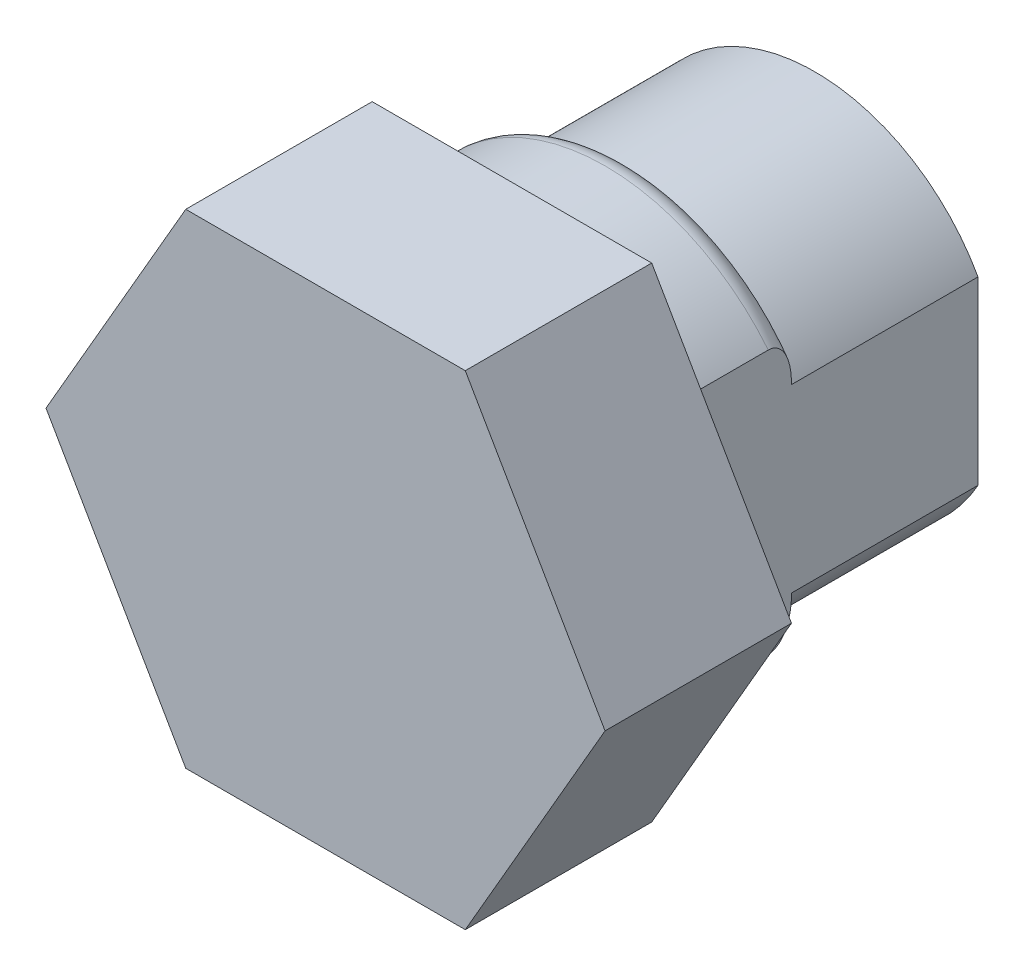
ISO-10303-21;
HEADER;
FILE_DESCRIPTION(('STEP AP214'),'2;1');
FILE_NAME('part.step','',(''),(''),'','','');
FILE_SCHEMA(('AUTOMOTIVE_DESIGN { 1 0 10303 214 1 1 1 1 }'));
ENDSEC;
DATA;
#1=APPLICATION_CONTEXT('core data for automotive mechanical design processes');
#2=APPLICATION_PROTOCOL_DEFINITION('international standard','automotive_design',2000,#1);
#3=PRODUCT_CONTEXT('',#1,'mechanical');
#4=PRODUCT('Part','Part','',(#3));
#5=PRODUCT_RELATED_PRODUCT_CATEGORY('part','',(#4));
#6=PRODUCT_DEFINITION_FORMATION('','',#4);
#7=PRODUCT_DEFINITION_CONTEXT('part definition',#1,'design');
#8=PRODUCT_DEFINITION('design','',#6,#7);
#9=PRODUCT_DEFINITION_SHAPE('','',#8);
#10=(LENGTH_UNIT() NAMED_UNIT(*) SI_UNIT(.MILLI.,.METRE.));
#11=(NAMED_UNIT(*) PLANE_ANGLE_UNIT() SI_UNIT($,.RADIAN.));
#12=(NAMED_UNIT(*) SI_UNIT($,.STERADIAN.) SOLID_ANGLE_UNIT());
#13=UNCERTAINTY_MEASURE_WITH_UNIT(LENGTH_MEASURE(1.E-05),#10,'distance_accuracy_value','');
#14=(GEOMETRIC_REPRESENTATION_CONTEXT(3) GLOBAL_UNCERTAINTY_ASSIGNED_CONTEXT((#13)) GLOBAL_UNIT_ASSIGNED_CONTEXT((#10,
#11,#12)) REPRESENTATION_CONTEXT('',''));
#15=CARTESIAN_POINT('',(0.,0.,0.));
#16=DIRECTION('',(0.,0.,1.));
#17=DIRECTION('',(1.,0.,0.));
#18=AXIS2_PLACEMENT_3D('',#15,#16,#17);
#19=CARTESIAN_POINT('',(0.,0.,8.));
#20=DIRECTION('',(0.,0.,-1.));
#21=DIRECTION('',(-1.,0.,0.));
#22=AXIS2_PLACEMENT_3D('',#19,#20,#21);
#23=CYLINDRICAL_SURFACE('',#22,8.);
#24=DIRECTION('',(0.,0.,-1.));
#25=VECTOR('',#24,1.);
#26=CARTESIAN_POINT('',(0.499999999999999,-7.98435971133565,8.));
#27=LINE('',#26,#25);
#28=CARTESIAN_POINT('',(0.499999999999999,-7.98435971133565,0.));
#29=VERTEX_POINT('',#28);
#30=CARTESIAN_POINT('',(0.499999999999999,-7.98435971133566,7.99999999999996));
#31=VERTEX_POINT('',#30);
#32=EDGE_CURVE('E209',#29,#31,#27,.F.);
#33=ORIENTED_EDGE('',*,*,#32,.F.);
#34=CARTESIAN_POINT('',(0.,0.,0.));
#35=DIRECTION('',(0.,0.,1.));
#36=DIRECTION('',(1.,0.,0.));
#37=AXIS2_PLACEMENT_3D('',#34,#35,#36);
#38=CIRCLE('',#37,8.);
#39=CARTESIAN_POINT('',(7.,-3.87298334620742,0.));
#40=VERTEX_POINT('',#39);
#41=EDGE_CURVE('E181',#29,#40,#38,.T.);
#42=ORIENTED_EDGE('',*,*,#41,.T.);
#43=DIRECTION('',(0.,0.,-1.));
#44=VECTOR('',#43,1.);
#45=CARTESIAN_POINT('',(7.,-3.87298334620742,8.));
#46=LINE('',#45,#44);
#47=CARTESIAN_POINT('',(7.,-3.87298334620742,8.));
#48=VERTEX_POINT('',#47);
#49=EDGE_CURVE('E233',#40,#48,#46,.F.);
#50=ORIENTED_EDGE('',*,*,#49,.T.);
#51=CARTESIAN_POINT('',(0.,0.,8.));
#52=DIRECTION('',(0.,0.,1.));
#53=DIRECTION('',(1.,0.,0.));
#54=AXIS2_PLACEMENT_3D('',#51,#52,#53);
#55=CIRCLE('',#54,8.);
#56=EDGE_CURVE('E295',#31,#48,#55,.T.);
#57=ORIENTED_EDGE('',*,*,#56,.F.);
#58=EDGE_LOOP('',(#33,#42,#50,#57));
#59=FACE_BOUND('',#58,.T.);
#60=ADVANCED_FACE('F33',(#59),#23,.T.);
#61=DIRECTION('',(0.,0.,-1.));
#62=VECTOR('',#61,1.);
#63=CARTESIAN_POINT('',(-0.500000000000001,-7.98435971133565,8.));
#64=LINE('',#63,#62);
#65=CARTESIAN_POINT('',(-0.500000000000001,-7.98435971133565,8.));
#66=VERTEX_POINT('',#65);
#67=CARTESIAN_POINT('',(-0.500000000000001,-7.98435971133565,0.));
#68=VERTEX_POINT('',#67);
#69=EDGE_CURVE('E201',#66,#68,#64,.T.);
#70=ORIENTED_EDGE('',*,*,#69,.F.);
#71=CARTESIAN_POINT('',(-7.,-3.87298334620742,8.));
#72=VERTEX_POINT('',#71);
#73=EDGE_CURVE('E294',#72,#66,#55,.T.);
#74=ORIENTED_EDGE('',*,*,#73,.F.);
#75=DIRECTION('',(0.,0.,-1.));
#76=VECTOR('',#75,1.);
#77=CARTESIAN_POINT('',(-7.,-3.87298334620742,8.));
#78=LINE('',#77,#76);
#79=CARTESIAN_POINT('',(-7.,-3.87298334620742,0.));
#80=VERTEX_POINT('',#79);
#81=EDGE_CURVE('E223',#80,#72,#78,.F.);
#82=ORIENTED_EDGE('',*,*,#81,.F.);
#83=EDGE_CURVE('E299',#80,#68,#38,.T.);
#84=ORIENTED_EDGE('',*,*,#83,.T.);
#85=EDGE_LOOP('',(#70,#74,#82,#84));
#86=FACE_BOUND('',#85,.T.);
#87=ADVANCED_FACE('F361',(#86),#23,.T.);
#88=CARTESIAN_POINT('',(0.,0.,13.));
#89=DIRECTION('',(0.,0.,-1.));
#90=DIRECTION('',(-1.,0.,0.));
#91=AXIS2_PLACEMENT_3D('',#88,#89,#90);
#92=CYLINDRICAL_SURFACE('',#91,9.);
#93=DIRECTION('',(0.,0.,-1.));
#94=VECTOR('',#93,1.);
#95=CARTESIAN_POINT('',(0.499999999999999,-8.98610037780571,13.));
#96=LINE('',#95,#94);
#97=CARTESIAN_POINT('',(0.499999999999999,-8.98610037780572,9.));
#98=VERTEX_POINT('',#97);
#99=CARTESIAN_POINT('',(0.499999999999999,-8.98610037780571,13.));
#100=VERTEX_POINT('',#99);
#101=EDGE_CURVE('E207',#98,#100,#96,.F.);
#102=ORIENTED_EDGE('',*,*,#101,.F.);
#103=CARTESIAN_POINT('',(0.,0.,9.));
#104=DIRECTION('',(0.,0.,1.));
#105=DIRECTION('',(1.,0.,0.));
#106=AXIS2_PLACEMENT_3D('',#103,#104,#105);
#107=CIRCLE('',#106,9.);
#108=CARTESIAN_POINT('',(7.,-5.65685424949238,9.));
#109=VERTEX_POINT('',#108);
#110=EDGE_CURVE('E293',#98,#109,#107,.T.);
#111=ORIENTED_EDGE('',*,*,#110,.T.);
#112=DIRECTION('',(0.,0.,-1.));
#113=VECTOR('',#112,1.);
#114=CARTESIAN_POINT('',(7.,-5.65685424949238,13.));
#115=LINE('',#114,#113);
#116=CARTESIAN_POINT('',(7.,-5.65685424949238,13.));
#117=VERTEX_POINT('',#116);
#118=EDGE_CURVE('E230',#109,#117,#115,.F.);
#119=ORIENTED_EDGE('',*,*,#118,.T.);
#120=CARTESIAN_POINT('',(0.,0.,13.));
#121=DIRECTION('',(0.,0.,1.));
#122=DIRECTION('',(1.,0.,0.));
#123=AXIS2_PLACEMENT_3D('',#120,#121,#122);
#124=CIRCLE('',#123,9.);
#125=EDGE_CURVE('E286',#100,#117,#124,.T.);
#126=ORIENTED_EDGE('',*,*,#125,.F.);
#127=EDGE_LOOP('',(#102,#111,#119,#126));
#128=FACE_BOUND('',#127,.T.);
#129=ADVANCED_FACE('F366',(#128),#92,.T.);
#130=DIRECTION('',(0.,0.,-1.));
#131=VECTOR('',#130,1.);
#132=CARTESIAN_POINT('',(-0.500000000000001,-8.98610037780571,13.));
#133=LINE('',#132,#131);
#134=CARTESIAN_POINT('',(-0.500000000000001,-8.98610037780571,13.));
#135=VERTEX_POINT('',#134);
#136=CARTESIAN_POINT('',(-0.500000000000001,-8.98610037780571,9.));
#137=VERTEX_POINT('',#136);
#138=EDGE_CURVE('E52',#135,#137,#133,.T.);
#139=ORIENTED_EDGE('',*,*,#138,.F.);
#140=CARTESIAN_POINT('',(-7.,-5.65685424949238,13.));
#141=VERTEX_POINT('',#140);
#142=EDGE_CURVE('E290',#141,#135,#124,.T.);
#143=ORIENTED_EDGE('',*,*,#142,.F.);
#144=DIRECTION('',(0.,0.,-1.));
#145=VECTOR('',#144,1.);
#146=CARTESIAN_POINT('',(-7.,-5.65685424949238,13.));
#147=LINE('',#146,#145);
#148=CARTESIAN_POINT('',(-7.,-5.65685424949238,9.));
#149=VERTEX_POINT('',#148);
#150=EDGE_CURVE('E215',#149,#141,#147,.F.);
#151=ORIENTED_EDGE('',*,*,#150,.F.);
#152=EDGE_CURVE('E300',#149,#137,#107,.T.);
#153=ORIENTED_EDGE('',*,*,#152,.T.);
#154=EDGE_LOOP('',(#139,#143,#151,#153));
#155=FACE_BOUND('',#154,.T.);
#156=ADVANCED_FACE('F401',(#155),#92,.T.);
#157=CARTESIAN_POINT('',(0.,0.,13.));
#158=DIRECTION('',(0.,0.,1.));
#159=DIRECTION('',(1.,0.,0.));
#160=AXIS2_PLACEMENT_3D('',#157,#158,#159);
#161=PLANE('',#160);
#162=DIRECTION('',(0.,-1.,0.));
#163=VECTOR('',#162,1.);
#164=CARTESIAN_POINT('',(0.499999999999999,-7.0725148219795,13.));
#165=LINE('',#164,#163);
#166=CARTESIAN_POINT('',(0.499999999999999,-10.3882095556926,13.));
#167=VERTEX_POINT('',#166);
#168=EDGE_CURVE('E199',#100,#167,#165,.T.);
#169=ORIENTED_EDGE('',*,*,#168,.F.);
#170=ORIENTED_EDGE('',*,*,#125,.T.);
#171=DIRECTION('',(0.,1.,0.));
#172=VECTOR('',#171,1.);
#173=CARTESIAN_POINT('',(7.,0.,13.));
#174=LINE('',#173,#172);
#175=CARTESIAN_POINT('',(7.,5.65685424949238,13.));
#176=VERTEX_POINT('',#175);
#177=EDGE_CURVE('E212',#117,#176,#174,.T.);
#178=ORIENTED_EDGE('',*,*,#177,.T.);
#179=CARTESIAN_POINT('',(-7.,5.65685424949238,13.));
#180=VERTEX_POINT('',#179);
#181=EDGE_CURVE('E287',#176,#180,#124,.T.);
#182=ORIENTED_EDGE('',*,*,#181,.T.);
#183=DIRECTION('',(0.,1.,0.));
#184=VECTOR('',#183,1.);
#185=CARTESIAN_POINT('',(-7.,0.,13.));
#186=LINE('',#185,#184);
#187=EDGE_CURVE('E218',#141,#180,#186,.T.);
#188=ORIENTED_EDGE('',*,*,#187,.F.);
#189=ORIENTED_EDGE('',*,*,#142,.T.);
#190=DIRECTION('',(0.,1.,0.));
#191=VECTOR('',#190,1.);
#192=CARTESIAN_POINT('',(-0.500000000000001,-7.0725148219795,13.));
#193=LINE('',#192,#191);
#194=CARTESIAN_POINT('',(-0.500000000000001,-10.3882095556926,13.));
#195=VERTEX_POINT('',#194);
#196=EDGE_CURVE('E185',#195,#135,#193,.T.);
#197=ORIENTED_EDGE('',*,*,#196,.F.);
#198=DIRECTION('',(1.,0.,0.));
#199=VECTOR('',#198,1.);
#200=CARTESIAN_POINT('',(-5.99763558337725,-10.3882095556926,13.));
#201=LINE('',#200,#199);
#202=CARTESIAN_POINT('',(-5.99763558337725,-10.3882095556926,13.));
#203=VERTEX_POINT('',#202);
#204=EDGE_CURVE('E247',#203,#195,#201,.T.);
#205=ORIENTED_EDGE('',*,*,#204,.F.);
#206=DIRECTION('',(0.500000000000007,-0.866025403784435,0.));
#207=VECTOR('',#206,1.);
#208=CARTESIAN_POINT('',(-11.9952711667547,0.,13.));
#209=LINE('',#208,#207);
#210=CARTESIAN_POINT('',(-11.9952711667547,0.,13.));
#211=VERTEX_POINT('',#210);
#212=EDGE_CURVE('E265',#211,#203,#209,.T.);
#213=ORIENTED_EDGE('',*,*,#212,.F.);
#214=DIRECTION('',(-0.499999999999995,-0.866025403784441,0.));
#215=VECTOR('',#214,1.);
#216=CARTESIAN_POINT('',(-5.9976355833774,10.3882095556925,13.));
#217=LINE('',#216,#215);
#218=CARTESIAN_POINT('',(-5.9976355833774,10.3882095556925,13.));
#219=VERTEX_POINT('',#218);
#220=EDGE_CURVE('E263',#219,#211,#217,.T.);
#221=ORIENTED_EDGE('',*,*,#220,.F.);
#222=DIRECTION('',(-1.,0.,0.));
#223=VECTOR('',#222,1.);
#224=CARTESIAN_POINT('',(5.99763558337732,10.3882095556926,13.));
#225=LINE('',#224,#223);
#226=CARTESIAN_POINT('',(5.99763558337732,10.3882095556926,13.));
#227=VERTEX_POINT('',#226);
#228=EDGE_CURVE('E261',#227,#219,#225,.T.);
#229=ORIENTED_EDGE('',*,*,#228,.F.);
#230=DIRECTION('',(-0.500000000000001,0.866025403784438,0.));
#231=VECTOR('',#230,1.);
#232=CARTESIAN_POINT('',(11.9952711667547,0.,13.));
#233=LINE('',#232,#231);
#234=CARTESIAN_POINT('',(11.9952711667547,0.,13.));
#235=VERTEX_POINT('',#234);
#236=EDGE_CURVE('E259',#235,#227,#233,.T.);
#237=ORIENTED_EDGE('',*,*,#236,.F.);
#238=DIRECTION('',(0.499999999999995,0.866025403784441,0.));
#239=VECTOR('',#238,1.);
#240=CARTESIAN_POINT('',(5.99763558337747,-10.3882095556925,13.));
#241=LINE('',#240,#239);
#242=CARTESIAN_POINT('',(5.99763558337747,-10.3882095556925,13.));
#243=VERTEX_POINT('',#242);
#244=EDGE_CURVE('E242',#243,#235,#241,.T.);
#245=ORIENTED_EDGE('',*,*,#244,.F.);
#246=EDGE_CURVE('E267',#167,#243,#201,.T.);
#247=ORIENTED_EDGE('',*,*,#246,.F.);
#248=EDGE_LOOP('',(#169,#170,#178,#182,#188,#189,#197,#205,#213,#221,#229,#237,#245,#247));
#249=FACE_BOUND('',#248,.T.);
#250=ADVANCED_FACE('F345',(#249),#161,.F.);
#251=CARTESIAN_POINT('',(0.,0.,9.));
#252=DIRECTION('',(0.,0.,1.));
#253=DIRECTION('',(1.,0.,0.));
#254=AXIS2_PLACEMENT_3D('',#251,#252,#253);
#255=TOROIDAL_SURFACE('',#254,8.,1.);
#256=ORIENTED_EDGE('',*,*,#110,.F.);
#257=CARTESIAN_POINT('',(0.499999999999999,-8.66024322517779,8.26187592581212));
#258=CARTESIAN_POINT('',(0.499999999999999,-8.61865872685159,8.22393319159111));
#259=CARTESIAN_POINT('',(0.499999999999999,-8.57383523766527,8.18947879089425));
#260=CARTESIAN_POINT('',(0.499999999999999,-8.47899989037954,8.12856004026763));
#261=CARTESIAN_POINT('',(0.499999999999999,-8.42898174540785,8.10210552728329));
#262=CARTESIAN_POINT('',(0.499999999999999,-8.32523777849372,8.05797947270386));
#263=CARTESIAN_POINT('',(0.499999999999999,-8.27151399444691,8.0403031467672));
#264=CARTESIAN_POINT('',(0.499999999999999,-8.16187811369211,8.01421517091775));
#265=CARTESIAN_POINT('',(0.499999999999999,-8.10596656433086,8.00580121884887));
#266=CARTESIAN_POINT('',(0.499999999999999,-7.99345639597833,7.99845762014326));
#267=CARTESIAN_POINT('',(0.499999999999999,-7.93685703437675,7.99953934340476));
#268=CARTESIAN_POINT('',(0.499999999999999,-7.82463943329287,8.01118224893528));
#269=CARTESIAN_POINT('',(0.499999999999999,-7.76902123893041,8.02174386599273));
#270=CARTESIAN_POINT('',(0.499999999999999,-7.66030639047841,8.05205973653048));
#271=CARTESIAN_POINT('',(0.499999999999999,-7.60721155206088,8.07182050207525));
#272=CARTESIAN_POINT('',(0.499999999999999,-7.50509556457223,8.11998021406199));
#273=CARTESIAN_POINT('',(0.499999999999999,-7.45607440460512,8.14837913739827));
#274=CARTESIAN_POINT('',(0.499999999999999,-7.36353035315005,8.21299589202989));
#275=CARTESIAN_POINT('',(0.499999999999999,-7.32000433399105,8.24920924349308));
#276=CARTESIAN_POINT('',(0.499999999999999,-7.23966377301843,8.32844156134991));
#277=CARTESIAN_POINT('',(0.499999999999999,-7.20284915842519,8.37146045393362));
#278=CARTESIAN_POINT('',(0.499999999999999,-7.13705149858263,8.4629989820487));
#279=CARTESIAN_POINT('',(0.499999999999999,-7.10805406123128,8.51150827213052));
#280=CARTESIAN_POINT('',(0.499999999999999,-7.05863687845514,8.61271530628358));
#281=CARTESIAN_POINT('',(0.499999999999999,-7.03821702442697,8.66541299731417));
#282=CARTESIAN_POINT('',(0.499999999999999,-7.00658336211747,8.77336872942733));
#283=CARTESIAN_POINT('',(0.499999999999999,-6.99534816139451,8.82862050241373));
#284=CARTESIAN_POINT('',(0.499999999999999,-6.98232902381977,8.94022636266091));
#285=CARTESIAN_POINT('',(0.499999999999999,-6.98054498266883,8.99658043775025));
#286=CARTESIAN_POINT('',(0.499999999999999,-6.98647507573754,9.10870003767633));
#287=CARTESIAN_POINT('',(0.499999999999999,-6.9941747432575,9.16446632838489));
#288=CARTESIAN_POINT('',(0.499999999999999,-7.01882532176232,9.27391498171632));
#289=CARTESIAN_POINT('',(0.499999999999999,-7.03577622464295,9.32759734616469));
#290=CARTESIAN_POINT('',(0.499999999999999,-7.07844600428096,9.43137002783357));
#291=CARTESIAN_POINT('',(0.499999999999999,-7.10416686498209,9.48145952916897));
#292=CARTESIAN_POINT('',(0.499999999999999,-7.16363811990137,9.57662008997361));
#293=CARTESIAN_POINT('',(0.499999999999999,-7.19738858363534,9.62169110599066));
#294=CARTESIAN_POINT('',(0.499999999999999,-7.27202492582089,9.70562519720033));
#295=CARTESIAN_POINT('',(0.499999999999999,-7.31292374112938,9.74447676812568));
#296=CARTESIAN_POINT('',(0.499999999999999,-7.40065030640319,9.81478159383546));
#297=CARTESIAN_POINT('',(0.499999999999999,-7.44747813227375,9.84623475388812));
#298=CARTESIAN_POINT('',(0.499999999999999,-7.54585085473459,9.90092597532351));
#299=CARTESIAN_POINT('',(0.499999999999999,-7.5974064726582,9.92414475305317));
#300=CARTESIAN_POINT('',(0.499999999999999,-7.70367998621133,9.96161319317048));
#301=CARTESIAN_POINT('',(0.499999999999999,-7.75839791295633,9.97586276728943));
#302=CARTESIAN_POINT('',(0.499999999999999,-7.86953690650958,9.9950074374053));
#303=CARTESIAN_POINT('',(0.499999999999999,-7.92596055581478,9.99988754482455));
#304=CARTESIAN_POINT('',(0.499999999999999,-8.03882675897211,10.0001086049065));
#305=CARTESIAN_POINT('',(0.499999999999999,-8.09526931289092,9.99544952356386));
#306=CARTESIAN_POINT('',(0.499999999999999,-8.2065853225696,9.97671822206807));
#307=CARTESIAN_POINT('',(0.499999999999999,-8.26145837705858,9.96264361670577));
#308=CARTESIAN_POINT('',(0.499999999999999,-8.36805897210437,9.92547297232276));
#309=CARTESIAN_POINT('',(0.499999999999999,-8.41978652777177,9.90237697664363));
#310=CARTESIAN_POINT('',(0.499999999999999,-8.51857302340189,9.84784049813906));
#311=CARTESIAN_POINT('',(0.499999999999999,-8.56563641647957,9.8164080820367));
#312=CARTESIAN_POINT('',(0.499999999999999,-8.65380726769656,9.74607620659079));
#313=CARTESIAN_POINT('',(0.499999999999999,-8.69491476273547,9.70717679351228));
#314=CARTESIAN_POINT('',(0.499999999999999,-8.76993618006173,9.62308177148391));
#315=CARTESIAN_POINT('',(0.499999999999999,-8.80386153788138,9.57789636426252));
#316=CARTESIAN_POINT('',(0.499999999999999,-8.86363063291848,9.48246383460788));
#317=CARTESIAN_POINT('',(0.499999999999999,-8.88947442498477,9.43221674653084));
#318=CARTESIAN_POINT('',(0.499999999999999,-8.9323054364355,9.32817163768832));
#319=CARTESIAN_POINT('',(0.499999999999999,-8.94930638253951,9.27437926740454));
#320=CARTESIAN_POINT('',(0.499999999999999,-8.97402484918681,9.16470448112489));
#321=CARTESIAN_POINT('',(0.499999999999999,-8.98174279687792,9.10882216141795));
#322=CARTESIAN_POINT('',(0.499999999999999,-8.98767225009435,8.99661924512309));
#323=CARTESIAN_POINT('',(0.499999999999999,-8.98589447521636,8.94029921438105));
#324=CARTESIAN_POINT('',(0.499999999999999,-8.97290534943117,8.82874224785496));
#325=CARTESIAN_POINT('',(0.499999999999999,-8.96169167084195,8.77350558276019));
#326=CARTESIAN_POINT('',(0.499999999999999,-8.93014879774606,8.66568719977959));
#327=CARTESIAN_POINT('',(0.499999999999999,-8.90981685761981,8.61310628688298));
#328=CARTESIAN_POINT('',(0.499999999999999,-8.86062978552562,8.51214899655757));
#329=CARTESIAN_POINT('',(0.499999999999999,-8.83178493997232,8.46376763546017));
#330=CARTESIAN_POINT('',(0.499999999999999,-8.77878055814951,8.38978704765608));
#331=CARTESIAN_POINT('',(0.499999999999999,-8.75696075103206,8.36248049308622));
#332=CARTESIAN_POINT('',(0.499999999999999,-8.71059052690818,8.31029379330074));
#333=CARTESIAN_POINT('',(0.499999999999999,-8.68604011032438,8.28541364770957));
#334=CARTESIAN_POINT('',(0.499999999999999,-8.66024322517779,8.26187592581212));
#335=B_SPLINE_CURVE_WITH_KNOTS('',3,(#257,#258,#259,#260,#261,#262,#263,#264,#265,#266,#267,
#268,#269,#270,#271,#272,#273,#274,#275,#276,#277,#278,#279,#280,#281,#282,#283,#284,#285,#286,
#287,#288,#289,#290,#291,#292,#293,#294,#295,#296,#297,#298,#299,#300,#301,#302,#303,#304,#305,
#306,#307,#308,#309,#310,#311,#312,#313,#314,#315,#316,#317,#318,#319,#320,#321,#322,#323,#324,
#325,#326,#327,#328,#329,#330,#331,#332,#333,#334),.UNSPECIFIED.,.T.,.F.,(4,2,2,2,2,2,2,2,2,2,2,
2,2,2,2,2,2,2,2,2,2,2,2,2,2,2,2,2,2,2,2,2,2,2,2,2,2,2,4),(0.,0.168751797764604,
0.337710262771788,0.50657653965275,0.675400835463925,0.844427305062611,1.01346152733367,
1.18261559108104,1.35176920237231,1.52082609819105,1.68988116061837,1.85862281877606,
2.02736234038024,2.19570771335849,2.36405122854179,2.53213826581186,2.70022515583556,
2.86835009580595,3.036476491361,3.20491036819871,3.37334640160343,3.54217432123319,
3.71100390232482,3.88010334014921,4.04920338077987,4.21834627529451,4.38748835720379,
4.55646736246646,4.72544532077973,4.89415217136056,5.06285787691871,5.23130091369702,
5.39973619944207,5.56798138101679,5.7362680780779,5.90460548237135,6.07274030626203,
6.17742526325843,6.28211020405217),.UNSPECIFIED.);
#336=EDGE_CURVE('E11',#98,#31,#335,.T.);
#337=ORIENTED_EDGE('',*,*,#336,.T.);
#338=ORIENTED_EDGE('',*,*,#56,.T.);
#339=CARTESIAN_POINT('',(7.,-5.65685424949238,9.));
#340=CARTESIAN_POINT('',(7.,-5.65685911724098,8.97923940691457));
#341=CARTESIAN_POINT('',(7.,-5.65582471290436,8.95849280172404));
#342=CARTESIAN_POINT('',(7.,-5.65173267756998,8.91721974231378));
#343=CARTESIAN_POINT('',(7.,-5.64867700208882,8.89669309477786));
#344=CARTESIAN_POINT('',(7.,-5.63664614991689,8.83611526480784));
#345=CARTESIAN_POINT('',(7.,-5.62480441345385,8.79660524627055));
#346=CARTESIAN_POINT('',(7.,-5.59450303461577,8.72045034974561));
#347=CARTESIAN_POINT('',(7.,-5.57606672846917,8.68379591675615));
#348=CARTESIAN_POINT('',(7.,-5.53376244371056,8.61368775216316));
#349=CARTESIAN_POINT('',(7.,-5.50987991802476,8.58024293983661));
#350=CARTESIAN_POINT('',(7.,-5.44571696479316,8.50203184095132));
#351=CARTESIAN_POINT('',(7.,-5.40298945443793,8.45927985225059));
#352=CARTESIAN_POINT('',(7.,-5.31139784192795,8.38104847513847));
#353=CARTESIAN_POINT('',(7.,-5.26252382944355,8.34558108086482));
#354=CARTESIAN_POINT('',(7.,-5.13128822638562,8.26258919623405));
#355=CARTESIAN_POINT('',(7.,-5.04587839303067,8.2199190526631));
#356=CARTESIAN_POINT('',(7.,-4.86942025547898,8.14769392398842));
#357=CARTESIAN_POINT('',(7.,-4.77834350968735,8.11821240250006));
#358=CARTESIAN_POINT('',(7.,-4.6190935381239,8.07679160414368));
#359=CARTESIAN_POINT('',(7.,-4.55156838137016,8.0622550332273));
#360=CARTESIAN_POINT('',(7.,-4.41559399169471,8.03810124904663));
#361=CARTESIAN_POINT('',(7.,-4.34714402318652,8.02848822107254));
#362=CARTESIAN_POINT('',(7.,-4.21108801374642,8.01370252744642));
#363=CARTESIAN_POINT('',(7.,-4.14349033685777,8.008449693619));
#364=CARTESIAN_POINT('',(7.,-4.00824723487945,8.00160903069849));
#365=CARTESIAN_POINT('',(7.,-3.94060220575656,8.00001355477364));
#366=CARTESIAN_POINT('',(7.,-3.87298334620742,8.));
#367=B_SPLINE_CURVE_WITH_KNOTS('',3,(#339,#340,#341,#342,#343,#344,#345,#346,#347,#348,#349,
#350,#351,#352,#353,#354,#355,#356,#357,#358,#359,#360,#361,#362,#363,#364,#365,#366),
.UNSPECIFIED.,.F.,.F.,(4,2,2,2,2,2,2,2,2,2,2,2,2,4),(0.,0.0622297970683524,0.124399476637808,
0.24737938802525,0.36992834673037,0.492808554412042,0.673119945086272,0.85372588096302,
1.13856125057575,1.42496404234678,1.63199049314366,1.83919263727246,2.04249496179969,
2.24537183105546),.UNSPECIFIED.);
#368=EDGE_CURVE('E309',#109,#48,#367,.T.);
#369=ORIENTED_EDGE('',*,*,#368,.F.);
#370=EDGE_LOOP('',(#256,#337,#338,#369));
#371=FACE_BOUND('',#370,.T.);
#372=ADVANCED_FACE('F340',(#371),#255,.T.);
#373=ORIENTED_EDGE('',*,*,#73,.T.);
#374=CARTESIAN_POINT('',(-0.500000000000001,-8.66024322517779,8.26187592581212));
#375=CARTESIAN_POINT('',(-0.500000000000001,-8.70172458500228,8.29973130309595));
#376=CARTESIAN_POINT('',(-0.500000000000001,-8.74004263176906,8.34111306795245));
#377=CARTESIAN_POINT('',(-0.500000000000001,-8.8092205904506,8.42975562136744));
#378=CARTESIAN_POINT('',(-0.500000000000001,-8.84007161506814,8.4770233150904));
#379=CARTESIAN_POINT('',(-0.500000000000001,-8.89338483119361,8.57605430223978));
#380=CARTESIAN_POINT('',(-0.500000000000001,-8.91585053727007,8.62781570096553));
#381=CARTESIAN_POINT('',(-0.500000000000001,-8.95175763481953,8.73436396295248));
#382=CARTESIAN_POINT('',(-0.500000000000001,-8.96520125373997,8.78915007582956));
#383=CARTESIAN_POINT('',(-0.500000000000001,-8.9826824239134,8.90015973004582));
#384=CARTESIAN_POINT('',(-0.500000000000001,-8.98672724538706,8.95638212632227));
#385=CARTESIAN_POINT('',(-0.500000000000001,-8.985315863236,9.06870949172706));
#386=CARTESIAN_POINT('',(-0.500000000000001,-8.97985932950437,9.12481445670767));
#387=CARTESIAN_POINT('',(-0.500000000000001,-8.95960583475184,9.23528478625316));
#388=CARTESIAN_POINT('',(-0.500000000000001,-8.94481327471212,9.28965095780095));
#389=CARTESIAN_POINT('',(-0.500000000000001,-8.9063148309599,9.39512970862254));
#390=CARTESIAN_POINT('',(-0.500000000000001,-8.88260895761987,9.44624229168248));
#391=CARTESIAN_POINT('',(-0.500000000000001,-8.82694799041101,9.54378952528678));
#392=CARTESIAN_POINT('',(-0.500000000000001,-8.79498915172027,9.59022203889517));
#393=CARTESIAN_POINT('',(-0.500000000000001,-8.72373869266841,9.6770708655077));
#394=CARTESIAN_POINT('',(-0.500000000000001,-8.68444704563024,9.71748715662361));
#395=CARTESIAN_POINT('',(-0.500000000000001,-8.59959567878776,9.79121104053518));
#396=CARTESIAN_POINT('',(-0.500000000000001,-8.55402828517498,9.82450980100996));
#397=CARTESIAN_POINT('',(-0.500000000000001,-8.45795733227471,9.8829993317088));
#398=CARTESIAN_POINT('',(-0.500000000000001,-8.40745372544305,9.90819002382823));
#399=CARTESIAN_POINT('',(-0.500000000000001,-8.30285512712632,9.94979232300733));
#400=CARTESIAN_POINT('',(-0.500000000000001,-8.24875435971687,9.96618940798802));
#401=CARTESIAN_POINT('',(-0.500000000000001,-8.13856978152801,9.98968307318699));
#402=CARTESIAN_POINT('',(-0.500000000000001,-8.0824859535223,9.99677957259317));
#403=CARTESIAN_POINT('',(-0.500000000000001,-7.9698384665944,10.0014790126445));
#404=CARTESIAN_POINT('',(-0.500000000000001,-7.91327421961739,9.99906786449707));
#405=CARTESIAN_POINT('',(-0.500000000000001,-7.80135171976705,9.98479018601099));
#406=CARTESIAN_POINT('',(-0.500000000000001,-7.74599347403404,9.97292359970553));
#407=CARTESIAN_POINT('',(-0.500000000000001,-7.63801765528594,9.94005895307464));
#408=CARTESIAN_POINT('',(-0.500000000000001,-7.58540188570325,9.91905496682199));
#409=CARTESIAN_POINT('',(-0.500000000000001,-7.48444647884783,9.86850605688891));
#410=CARTESIAN_POINT('',(-0.500000000000001,-7.4361068359877,9.83896114436866));
#411=CARTESIAN_POINT('',(-0.500000000000001,-7.34511383786895,9.77218620041296));
#412=CARTESIAN_POINT('',(-0.500000000000001,-7.30245668308578,9.73496134695123));
#413=CARTESIAN_POINT('',(-0.500000000000001,-7.22401209668411,9.65386606964869));
#414=CARTESIAN_POINT('',(-0.500000000000001,-7.18822460004132,9.60999570871749));
#415=CARTESIAN_POINT('',(-0.500000000000001,-7.12461074279031,9.51694363017024));
#416=CARTESIAN_POINT('',(-0.500000000000001,-7.09676920863573,9.46777228615595));
#417=CARTESIAN_POINT('',(-0.500000000000001,-7.04975871070044,9.36544523881627));
#418=CARTESIAN_POINT('',(-0.500000000000001,-7.03058962612148,9.31228959100012));
#419=CARTESIAN_POINT('',(-0.500000000000001,-7.00151305551076,9.203635397102));
#420=CARTESIAN_POINT('',(-0.500000000000001,-6.99158416343933,9.14814257894675));
#421=CARTESIAN_POINT('',(-0.500000000000001,-6.98119854946647,9.03627771020089));
#422=CARTESIAN_POINT('',(-0.500000000000001,-6.98074173564009,8.97990566814831));
#423=CARTESIAN_POINT('',(-0.500000000000001,-6.98930717355724,8.86796750400034));
#424=CARTESIAN_POINT('',(-0.500000000000001,-6.99831594806109,8.81240034994851));
#425=CARTESIAN_POINT('',(-0.500000000000001,-7.02553146941619,8.7035665217017));
#426=CARTESIAN_POINT('',(-0.500000000000001,-7.04373820430286,8.65029984451438));
#427=CARTESIAN_POINT('',(-0.500000000000001,-7.0888337804364,8.54755583124495));
#428=CARTESIAN_POINT('',(-0.500000000000001,-7.11572571596012,8.49807985345958));
#429=CARTESIAN_POINT('',(-0.500000000000001,-7.17741917950991,8.40433330427071));
#430=CARTESIAN_POINT('',(-0.500000000000001,-7.21222079456665,8.36006279015137));
#431=CARTESIAN_POINT('',(-0.500000000000001,-7.28881478491936,8.27789224898076));
#432=CARTESIAN_POINT('',(-0.500000000000001,-7.33062034634376,8.24000451362366));
#433=CARTESIAN_POINT('',(-0.500000000000001,-7.41998634911178,8.17176563806121));
#434=CARTESIAN_POINT('',(-0.500000000000001,-7.46754687543605,8.14141460916678));
#435=CARTESIAN_POINT('',(-0.500000000000001,-7.56719210648629,8.08903775418312));
#436=CARTESIAN_POINT('',(-0.500000000000001,-7.61928709440931,8.06703149071255));
#437=CARTESIAN_POINT('',(-0.500000000000001,-7.72642674440711,8.03206306744813));
#438=CARTESIAN_POINT('',(-0.500000000000001,-7.78147131937463,8.01910064072981));
#439=CARTESIAN_POINT('',(-0.500000000000001,-7.89303294035404,8.00257130228533));
#440=CARTESIAN_POINT('',(-0.500000000000001,-7.94955195435523,7.99901767287987));
#441=CARTESIAN_POINT('',(-0.500000000000001,-8.06240014710983,8.00144782708632));
#442=CARTESIAN_POINT('',(-0.500000000000001,-8.11872927475055,8.00743400058395));
#443=CARTESIAN_POINT('',(-0.500000000000001,-8.22961308378517,8.02878486323518));
#444=CARTESIAN_POINT('',(-0.500000000000001,-8.28416661805654,8.04415549333065));
#445=CARTESIAN_POINT('',(-0.500000000000001,-8.38986566086638,8.08384153636381));
#446=CARTESIAN_POINT('',(-0.500000000000001,-8.44101519770315,8.10814614621595));
#447=CARTESIAN_POINT('',(-0.500000000000001,-8.52025993861578,8.15435708248193));
#448=CARTESIAN_POINT('',(-0.500000000000001,-8.54983557922207,8.17377394566094));
#449=CARTESIAN_POINT('',(-0.500000000000001,-8.60677293726992,8.21562018824915));
#450=CARTESIAN_POINT('',(-0.500000000000001,-8.63413465523597,8.23804956694465));
#451=CARTESIAN_POINT('',(-0.500000000000001,-8.66024322517779,8.26187592581212));
#452=B_SPLINE_CURVE_WITH_KNOTS('',3,(#374,#375,#376,#377,#378,#379,#380,#381,#382,#383,#384,
#385,#386,#387,#388,#389,#390,#391,#392,#393,#394,#395,#396,#397,#398,#399,#400,#401,#402,#403,
#404,#405,#406,#407,#408,#409,#410,#411,#412,#413,#414,#415,#416,#417,#418,#419,#420,#421,#422,
#423,#424,#425,#426,#427,#428,#429,#430,#431,#432,#433,#434,#435,#436,#437,#438,#439,#440,#441,
#442,#443,#444,#445,#446,#447,#448,#449,#450,#451),.UNSPECIFIED.,.T.,.F.,(4,2,2,2,2,2,2,2,2,2,2,
2,2,2,2,2,2,2,2,2,2,2,2,2,2,2,2,2,2,2,2,2,2,2,2,2,2,2,4),(0.,0.168345540484851,
0.336890472318612,0.505364681773332,0.673797281605529,0.842099550892444,1.01040766764526,
1.1786365035412,1.34686514366905,1.51517025287615,1.68347597439613,1.85198935349261,
2.02050435582167,2.18929679955066,2.35809070989473,2.52713483938189,2.69617996945024,
2.86533489508637,3.03448959969341,3.20353062726276,3.3725700547069,3.54128449233281,
3.70999657986893,3.87831684507345,4.04663547675683,4.21471477831023,4.38279386122876,
4.55093289186917,4.71907377264289,4.88753483985036,5.0559983949405,5.22485447256982,
5.39370556628308,5.56279489889853,5.73192659797742,5.90116547907025,6.07020038390479,
6.17615791225024,6.28211541549357),.UNSPECIFIED.);
#453=EDGE_CURVE('E45',#66,#137,#452,.T.);
#454=ORIENTED_EDGE('',*,*,#453,.T.);
#455=ORIENTED_EDGE('',*,*,#152,.F.);
#456=CARTESIAN_POINT('',(-7.,-3.87298334620742,8.));
#457=CARTESIAN_POINT('',(-7.,-3.95684752353764,8.00003408248208));
#458=CARTESIAN_POINT('',(-7.,-4.04078487195814,8.00247757846828));
#459=CARTESIAN_POINT('',(-7.,-4.2087345372575,8.01317814348608));
#460=CARTESIAN_POINT('',(-7.,-4.29274478573063,8.02146671232412));
#461=CARTESIAN_POINT('',(-7.,-4.46080241665493,8.04500693124566));
#462=CARTESIAN_POINT('',(-7.,-4.54483922714824,8.06033716157861));
#463=CARTESIAN_POINT('',(-7.,-4.71082956018272,8.09928527496176));
#464=CARTESIAN_POINT('',(-7.,-4.79278772836035,8.12288253070829));
#465=CARTESIAN_POINT('',(-7.,-4.92984673228816,8.17171603804811));
#466=CARTESIAN_POINT('',(-7.,-4.98582397154196,8.19447800215587));
#467=CARTESIAN_POINT('',(-7.,-5.09506853234419,8.2457104810547));
#468=CARTESIAN_POINT('',(-7.,-5.14833914849712,8.27417383654444));
#469=CARTESIAN_POINT('',(-7.,-5.25138662505751,8.3378986709081));
#470=CARTESIAN_POINT('',(-7.,-5.30112727268037,8.373219667287));
#471=CARTESIAN_POINT('',(-7.,-5.39450700199026,8.45126727633248));
#472=CARTESIAN_POINT('',(-7.,-5.43815394525255,8.49398418493013));
#473=CARTESIAN_POINT('',(-7.,-5.5043858678388,8.57288960015697));
#474=CARTESIAN_POINT('',(-7.,-5.52933189136241,8.60708643241079));
#475=CARTESIAN_POINT('',(-7.,-5.57349833671485,8.67891022161447));
#476=CARTESIAN_POINT('',(-7.,-5.59273583875009,8.71652649699582));
#477=CARTESIAN_POINT('',(-7.,-5.62400869754013,8.79413316701268));
#478=CARTESIAN_POINT('',(-7.,-5.63613712457294,8.83408498607083));
#479=CARTESIAN_POINT('',(-7.,-5.64846725208944,8.89538141329282));
#480=CARTESIAN_POINT('',(-7.,-5.65160097294741,8.91616481427999));
#481=CARTESIAN_POINT('',(-7.,-5.65579812504949,8.95796051445993));
#482=CARTESIAN_POINT('',(-7.,-5.65685943127998,8.97897302640858));
#483=CARTESIAN_POINT('',(-7.,-5.65685424949238,9.));
#484=B_SPLINE_CURVE_WITH_KNOTS('',3,(#456,#457,#458,#459,#460,#461,#462,#463,#464,#465,#466,
#467,#468,#469,#470,#471,#472,#473,#474,#475,#476,#477,#478,#479,#480,#481,#482,#483),
.UNSPECIFIED.,.F.,.F.,(4,2,2,2,2,2,2,2,2,2,2,2,2,4),(0.,0.251670270582328,0.504707291257274,
0.760639330205939,1.01593728078923,1.19695846772397,1.37775375346045,1.56019461118834,
1.74239788030092,1.86894436847718,1.99510831382814,2.11958136386814,2.18254393039712,
2.24557102368491),.UNSPECIFIED.);
#485=EDGE_CURVE('E334',#72,#149,#484,.T.);
#486=ORIENTED_EDGE('',*,*,#485,.F.);
#487=EDGE_LOOP('',(#373,#454,#455,#486));
#488=FACE_BOUND('',#487,.T.);
#489=ADVANCED_FACE('F344',(#488),#255,.T.);
#490=CARTESIAN_POINT('',(7.,3.87298334620742,8.));
#491=VERTEX_POINT('',#490);
#492=CARTESIAN_POINT('',(-7.,3.87298334620742,8.));
#493=VERTEX_POINT('',#492);
#494=EDGE_CURVE('E291',#491,#493,#55,.T.);
#495=ORIENTED_EDGE('',*,*,#494,.F.);
#496=DIRECTION('',(0.,0.,-1.));
#497=VECTOR('',#496,1.);
#498=CARTESIAN_POINT('',(7.,3.87298334620742,8.));
#499=LINE('',#498,#497);
#500=CARTESIAN_POINT('',(7.,3.87298334620742,0.));
#501=VERTEX_POINT('',#500);
#502=EDGE_CURVE('E239',#491,#501,#499,.T.);
#503=ORIENTED_EDGE('',*,*,#502,.T.);
#504=CARTESIAN_POINT('',(-7.,3.87298334620742,0.));
#505=VERTEX_POINT('',#504);
#506=EDGE_CURVE('E296',#501,#505,#38,.T.);
#507=ORIENTED_EDGE('',*,*,#506,.T.);
#508=DIRECTION('',(0.,0.,-1.));
#509=VECTOR('',#508,1.);
#510=CARTESIAN_POINT('',(-7.,3.87298334620742,8.));
#511=LINE('',#510,#509);
#512=EDGE_CURVE('E228',#493,#505,#511,.T.);
#513=ORIENTED_EDGE('',*,*,#512,.F.);
#514=EDGE_LOOP('',(#495,#503,#507,#513));
#515=FACE_BOUND('',#514,.T.);
#516=ADVANCED_FACE('F347',(#515),#23,.T.);
#517=CARTESIAN_POINT('',(0.,0.,0.));
#518=DIRECTION('',(0.,0.,1.));
#519=DIRECTION('',(1.,0.,0.));
#520=AXIS2_PLACEMENT_3D('',#517,#518,#519);
#521=PLANE('',#520);
#522=ORIENTED_EDGE('',*,*,#41,.F.);
#523=DIRECTION('',(0.,-1.,0.));
#524=VECTOR('',#523,1.);
#525=CARTESIAN_POINT('',(0.499999999999999,-7.0725148219795,0.));
#526=LINE('',#525,#524);
#527=CARTESIAN_POINT('',(0.499999999999999,-10.3882095556926,0.));
#528=VERTEX_POINT('',#527);
#529=EDGE_CURVE('E174',#29,#528,#526,.T.);
#530=ORIENTED_EDGE('',*,*,#529,.T.);
#531=DIRECTION('',(-1.,0.,0.));
#532=VECTOR('',#531,1.);
#533=CARTESIAN_POINT('',(0.499999999999999,-10.3882095556926,0.));
#534=LINE('',#533,#532);
#535=CARTESIAN_POINT('',(-0.500000000000001,-10.3882095556926,0.));
#536=VERTEX_POINT('',#535);
#537=EDGE_CURVE('E178',#528,#536,#534,.T.);
#538=ORIENTED_EDGE('',*,*,#537,.T.);
#539=DIRECTION('',(0.,1.,0.));
#540=VECTOR('',#539,1.);
#541=CARTESIAN_POINT('',(-0.500000000000001,-7.0725148219795,0.));
#542=LINE('',#541,#540);
#543=EDGE_CURVE('E195',#536,#68,#542,.T.);
#544=ORIENTED_EDGE('',*,*,#543,.T.);
#545=ORIENTED_EDGE('',*,*,#83,.F.);
#546=DIRECTION('',(0.,1.,0.));
#547=VECTOR('',#546,1.);
#548=CARTESIAN_POINT('',(-7.,0.,0.));
#549=LINE('',#548,#547);
#550=EDGE_CURVE('E211',#80,#505,#549,.T.);
#551=ORIENTED_EDGE('',*,*,#550,.T.);
#552=ORIENTED_EDGE('',*,*,#506,.F.);
#553=DIRECTION('',(0.,1.,0.));
#554=VECTOR('',#553,1.);
#555=CARTESIAN_POINT('',(7.,0.,0.));
#556=LINE('',#555,#554);
#557=EDGE_CURVE('E216',#40,#501,#556,.T.);
#558=ORIENTED_EDGE('',*,*,#557,.F.);
#559=EDGE_LOOP('',(#522,#530,#538,#544,#545,#551,#552,#558));
#560=FACE_BOUND('',#559,.T.);
#561=ADVANCED_FACE('F176',(#560),#521,.F.);
#562=DIRECTION('',(0.,0.,-1.));
#563=VECTOR('',#562,1.);
#564=CARTESIAN_POINT('',(7.,5.65685424949238,13.));
#565=LINE('',#564,#563);
#566=CARTESIAN_POINT('',(7.,5.65685424949238,9.));
#567=VERTEX_POINT('',#566);
#568=EDGE_CURVE('E236',#176,#567,#565,.T.);
#569=ORIENTED_EDGE('',*,*,#568,.T.);
#570=CARTESIAN_POINT('',(0.,0.,9.));
#571=DIRECTION('',(0.,0.,1.));
#572=DIRECTION('',(1.,0.,0.));
#573=AXIS2_PLACEMENT_3D('',#570,#571,#572);
#574=CIRCLE('',#573,9.);
#575=CARTESIAN_POINT('',(-7.,5.65685424949238,9.));
#576=VERTEX_POINT('',#575);
#577=EDGE_CURVE('E339',#567,#576,#574,.T.);
#578=ORIENTED_EDGE('',*,*,#577,.T.);
#579=DIRECTION('',(0.,0.,-1.));
#580=VECTOR('',#579,1.);
#581=CARTESIAN_POINT('',(-7.,5.65685424949238,13.));
#582=LINE('',#581,#580);
#583=EDGE_CURVE('E225',#180,#576,#582,.T.);
#584=ORIENTED_EDGE('',*,*,#583,.F.);
#585=ORIENTED_EDGE('',*,*,#181,.F.);
#586=EDGE_LOOP('',(#569,#578,#584,#585));
#587=FACE_BOUND('',#586,.T.);
#588=ADVANCED_FACE('F374',(#587),#92,.T.);
#589=CARTESIAN_POINT('',(5.99763558337747,-10.3882095556925,21.));
#590=DIRECTION('',(-0.866025403784442,0.499999999999995,0.));
#591=DIRECTION('',(-0.499999999999995,-0.866025403784442,0.));
#592=AXIS2_PLACEMENT_3D('',#589,#590,#591);
#593=PLANE('',#592);
#594=ORIENTED_EDGE('',*,*,#244,.T.);
#595=DIRECTION('',(0.,0.,-1.));
#596=VECTOR('',#595,1.);
#597=CARTESIAN_POINT('',(11.9952711667547,0.,21.));
#598=LINE('',#597,#596);
#599=CARTESIAN_POINT('',(11.9952711667547,0.,21.));
#600=VERTEX_POINT('',#599);
#601=EDGE_CURVE('E283',#600,#235,#598,.T.);
#602=ORIENTED_EDGE('',*,*,#601,.F.);
#603=DIRECTION('',(0.499999999999995,0.866025403784441,0.));
#604=VECTOR('',#603,1.);
#605=CARTESIAN_POINT('',(5.99763558337747,-10.3882095556925,21.));
#606=LINE('',#605,#604);
#607=CARTESIAN_POINT('',(5.99763558337747,-10.3882095556925,21.));
#608=VERTEX_POINT('',#607);
#609=EDGE_CURVE('E243',#608,#600,#606,.T.);
#610=ORIENTED_EDGE('',*,*,#609,.F.);
#611=DIRECTION('',(0.,0.,-1.));
#612=VECTOR('',#611,1.);
#613=CARTESIAN_POINT('',(5.99763558337747,-10.3882095556925,21.));
#614=LINE('',#613,#612);
#615=EDGE_CURVE('E257',#608,#243,#614,.T.);
#616=ORIENTED_EDGE('',*,*,#615,.T.);
#617=EDGE_LOOP('',(#594,#602,#610,#616));
#618=FACE_BOUND('',#617,.T.);
#619=ADVANCED_FACE('F436',(#618),#593,.F.);
#620=CARTESIAN_POINT('',(11.9952711667547,0.,21.));
#621=DIRECTION('',(-0.866025403784438,-0.500000000000001,0.));
#622=DIRECTION('',(0.500000000000001,-0.866025403784438,0.));
#623=AXIS2_PLACEMENT_3D('',#620,#621,#622);
#624=PLANE('',#623);
#625=ORIENTED_EDGE('',*,*,#236,.T.);
#626=DIRECTION('',(0.,0.,-1.));
#627=VECTOR('',#626,1.);
#628=CARTESIAN_POINT('',(5.99763558337732,10.3882095556926,21.));
#629=LINE('',#628,#627);
#630=CARTESIAN_POINT('',(5.99763558337732,10.3882095556926,21.));
#631=VERTEX_POINT('',#630);
#632=EDGE_CURVE('E280',#631,#227,#629,.T.);
#633=ORIENTED_EDGE('',*,*,#632,.F.);
#634=DIRECTION('',(-0.500000000000001,0.866025403784438,0.));
#635=VECTOR('',#634,1.);
#636=CARTESIAN_POINT('',(11.9952711667547,0.,21.));
#637=LINE('',#636,#635);
#638=EDGE_CURVE('E246',#600,#631,#637,.T.);
#639=ORIENTED_EDGE('',*,*,#638,.F.);
#640=ORIENTED_EDGE('',*,*,#601,.T.);
#641=EDGE_LOOP('',(#625,#633,#639,#640));
#642=FACE_BOUND('',#641,.T.);
#643=ADVANCED_FACE('F433',(#642),#624,.F.);
#644=CARTESIAN_POINT('',(5.99763558337732,10.3882095556926,21.));
#645=DIRECTION('',(0.,-1.,0.));
#646=DIRECTION('',(1.,0.,0.));
#647=AXIS2_PLACEMENT_3D('',#644,#645,#646);
#648=PLANE('',#647);
#649=ORIENTED_EDGE('',*,*,#228,.T.);
#650=DIRECTION('',(0.,0.,-1.));
#651=VECTOR('',#650,1.);
#652=CARTESIAN_POINT('',(-5.9976355833774,10.3882095556925,21.));
#653=LINE('',#652,#651);
#654=CARTESIAN_POINT('',(-5.9976355833774,10.3882095556925,21.));
#655=VERTEX_POINT('',#654);
#656=EDGE_CURVE('E277',#655,#219,#653,.T.);
#657=ORIENTED_EDGE('',*,*,#656,.F.);
#658=DIRECTION('',(-1.,0.,0.));
#659=VECTOR('',#658,1.);
#660=CARTESIAN_POINT('',(5.99763558337732,10.3882095556926,21.));
#661=LINE('',#660,#659);
#662=EDGE_CURVE('E249',#631,#655,#661,.T.);
#663=ORIENTED_EDGE('',*,*,#662,.F.);
#664=ORIENTED_EDGE('',*,*,#632,.T.);
#665=EDGE_LOOP('',(#649,#657,#663,#664));
#666=FACE_BOUND('',#665,.T.);
#667=ADVANCED_FACE('F430',(#666),#648,.F.);
#668=CARTESIAN_POINT('',(-5.9976355833774,10.3882095556925,21.));
#669=DIRECTION('',(0.866025403784441,-0.499999999999995,0.));
#670=DIRECTION('',(0.499999999999995,0.866025403784442,0.));
#671=AXIS2_PLACEMENT_3D('',#668,#669,#670);
#672=PLANE('',#671);
#673=ORIENTED_EDGE('',*,*,#220,.T.);
#674=DIRECTION('',(0.,0.,-1.));
#675=VECTOR('',#674,1.);
#676=CARTESIAN_POINT('',(-11.9952711667547,0.,21.));
#677=LINE('',#676,#675);
#678=CARTESIAN_POINT('',(-11.9952711667547,0.,21.));
#679=VERTEX_POINT('',#678);
#680=EDGE_CURVE('E274',#679,#211,#677,.T.);
#681=ORIENTED_EDGE('',*,*,#680,.F.);
#682=DIRECTION('',(-0.499999999999995,-0.866025403784441,0.));
#683=VECTOR('',#682,1.);
#684=CARTESIAN_POINT('',(-5.9976355833774,10.3882095556925,21.));
#685=LINE('',#684,#683);
#686=EDGE_CURVE('E251',#655,#679,#685,.T.);
#687=ORIENTED_EDGE('',*,*,#686,.F.);
#688=ORIENTED_EDGE('',*,*,#656,.T.);
#689=EDGE_LOOP('',(#673,#681,#687,#688));
#690=FACE_BOUND('',#689,.T.);
#691=ADVANCED_FACE('F425',(#690),#672,.F.);
#692=CARTESIAN_POINT('',(-11.9952711667547,0.,21.));
#693=DIRECTION('',(0.866025403784434,0.500000000000007,0.));
#694=DIRECTION('',(-0.500000000000007,0.866025403784435,0.));
#695=AXIS2_PLACEMENT_3D('',#692,#693,#694);
#696=PLANE('',#695);
#697=ORIENTED_EDGE('',*,*,#212,.T.);
#698=DIRECTION('',(0.,0.,-1.));
#699=VECTOR('',#698,1.);
#700=CARTESIAN_POINT('',(-5.99763558337725,-10.3882095556926,21.));
#701=LINE('',#700,#699);
#702=CARTESIAN_POINT('',(-5.99763558337725,-10.3882095556926,21.));
#703=VERTEX_POINT('',#702);
#704=EDGE_CURVE('E271',#703,#203,#701,.T.);
#705=ORIENTED_EDGE('',*,*,#704,.F.);
#706=DIRECTION('',(0.500000000000007,-0.866025403784435,0.));
#707=VECTOR('',#706,1.);
#708=CARTESIAN_POINT('',(-11.9952711667547,0.,21.));
#709=LINE('',#708,#707);
#710=EDGE_CURVE('E253',#679,#703,#709,.T.);
#711=ORIENTED_EDGE('',*,*,#710,.F.);
#712=ORIENTED_EDGE('',*,*,#680,.T.);
#713=EDGE_LOOP('',(#697,#705,#711,#712));
#714=FACE_BOUND('',#713,.T.);
#715=ADVANCED_FACE('F419',(#714),#696,.F.);
#716=CARTESIAN_POINT('',(-5.99763558337725,-10.3882095556926,21.));
#717=DIRECTION('',(0.,1.,0.));
#718=DIRECTION('',(-1.,0.,0.));
#719=AXIS2_PLACEMENT_3D('',#716,#717,#718);
#720=PLANE('',#719);
#721=ORIENTED_EDGE('',*,*,#204,.T.);
#722=DIRECTION('',(0.,0.,1.));
#723=VECTOR('',#722,1.);
#724=CARTESIAN_POINT('',(-0.500000000000001,-10.3882095556926,0.));
#725=LINE('',#724,#723);
#726=EDGE_CURVE('E193',#536,#195,#725,.T.);
#727=ORIENTED_EDGE('',*,*,#726,.F.);
#728=ORIENTED_EDGE('',*,*,#537,.F.);
#729=DIRECTION('',(0.,0.,1.));
#730=VECTOR('',#729,1.);
#731=CARTESIAN_POINT('',(0.499999999999999,-10.3882095556926,0.));
#732=LINE('',#731,#730);
#733=EDGE_CURVE('E191',#528,#167,#732,.T.);
#734=ORIENTED_EDGE('',*,*,#733,.T.);
#735=ORIENTED_EDGE('',*,*,#246,.T.);
#736=ORIENTED_EDGE('',*,*,#615,.F.);
#737=DIRECTION('',(1.,0.,0.));
#738=VECTOR('',#737,1.);
#739=CARTESIAN_POINT('',(-5.99763558337725,-10.3882095556926,21.));
#740=LINE('',#739,#738);
#741=EDGE_CURVE('E255',#703,#608,#740,.T.);
#742=ORIENTED_EDGE('',*,*,#741,.F.);
#743=ORIENTED_EDGE('',*,*,#704,.T.);
#744=EDGE_LOOP('',(#721,#727,#728,#734,#735,#736,#742,#743));
#745=FACE_BOUND('',#744,.T.);
#746=ADVANCED_FACE('F190',(#745),#720,.F.);
#747=CARTESIAN_POINT('',(0.,0.,21.));
#748=DIRECTION('',(0.,0.,1.));
#749=DIRECTION('',(1.,0.,0.));
#750=AXIS2_PLACEMENT_3D('',#747,#748,#749);
#751=PLANE('',#750);
#752=ORIENTED_EDGE('',*,*,#609,.T.);
#753=ORIENTED_EDGE('',*,*,#638,.T.);
#754=ORIENTED_EDGE('',*,*,#662,.T.);
#755=ORIENTED_EDGE('',*,*,#686,.T.);
#756=ORIENTED_EDGE('',*,*,#710,.T.);
#757=ORIENTED_EDGE('',*,*,#741,.T.);
#758=EDGE_LOOP('',(#752,#753,#754,#755,#756,#757));
#759=FACE_BOUND('',#758,.T.);
#760=ADVANCED_FACE('F326',(#759),#751,.T.);
#761=CARTESIAN_POINT('',(-7.,0.,13.));
#762=DIRECTION('',(-1.,0.,0.));
#763=DIRECTION('',(0.,0.,1.));
#764=AXIS2_PLACEMENT_3D('',#761,#762,#763);
#765=PLANE('',#764);
#766=ORIENTED_EDGE('',*,*,#81,.T.);
#767=ORIENTED_EDGE('',*,*,#485,.T.);
#768=ORIENTED_EDGE('',*,*,#150,.T.);
#769=ORIENTED_EDGE('',*,*,#187,.T.);
#770=ORIENTED_EDGE('',*,*,#583,.T.);
#771=CARTESIAN_POINT('',(-7.,5.65685424949238,9.));
#772=CARTESIAN_POINT('',(-7.,5.65685911724098,8.97923940691457));
#773=CARTESIAN_POINT('',(-7.,5.65582471290436,8.95849280172404));
#774=CARTESIAN_POINT('',(-7.,5.65173267756998,8.91721974231378));
#775=CARTESIAN_POINT('',(-7.,5.64867700208882,8.89669309477786));
#776=CARTESIAN_POINT('',(-7.,5.63664614991689,8.83611526480784));
#777=CARTESIAN_POINT('',(-7.,5.62480441345385,8.79660524627055));
#778=CARTESIAN_POINT('',(-7.,5.59450303461577,8.72045034974561));
#779=CARTESIAN_POINT('',(-7.,5.57606672846917,8.68379591675615));
#780=CARTESIAN_POINT('',(-7.,5.53376244371056,8.61368775216316));
#781=CARTESIAN_POINT('',(-7.,5.50987991802476,8.58024293983661));
#782=CARTESIAN_POINT('',(-7.,5.44571696479316,8.50203184095132));
#783=CARTESIAN_POINT('',(-7.,5.40298945443793,8.45927985225059));
#784=CARTESIAN_POINT('',(-7.,5.31139784192795,8.38104847513847));
#785=CARTESIAN_POINT('',(-7.,5.26252382944355,8.34558108086482));
#786=CARTESIAN_POINT('',(-7.,5.13128822638562,8.26258919623405));
#787=CARTESIAN_POINT('',(-7.,5.04587839303067,8.2199190526631));
#788=CARTESIAN_POINT('',(-7.,4.86942025547898,8.14769392398842));
#789=CARTESIAN_POINT('',(-7.,4.77834350968735,8.11821240250006));
#790=CARTESIAN_POINT('',(-7.,4.6190935381239,8.07679160414368));
#791=CARTESIAN_POINT('',(-7.,4.55156838137016,8.0622550332273));
#792=CARTESIAN_POINT('',(-7.,4.41559399169471,8.03810124904663));
#793=CARTESIAN_POINT('',(-7.,4.34714402318652,8.02848822107254));
#794=CARTESIAN_POINT('',(-7.,4.21108801374642,8.01370252744642));
#795=CARTESIAN_POINT('',(-7.,4.14349033685777,8.008449693619));
#796=CARTESIAN_POINT('',(-7.,4.00824723487945,8.00160903069849));
#797=CARTESIAN_POINT('',(-7.,3.94060220575656,8.00001355477364));
#798=CARTESIAN_POINT('',(-7.,3.87298334620742,8.));
#799=B_SPLINE_CURVE_WITH_KNOTS('',3,(#771,#772,#773,#774,#775,#776,#777,#778,#779,#780,#781,
#782,#783,#784,#785,#786,#787,#788,#789,#790,#791,#792,#793,#794,#795,#796,#797,#798),
.UNSPECIFIED.,.F.,.F.,(4,2,2,2,2,2,2,2,2,2,2,2,2,4),(0.,0.0622297970683524,0.124399476637808,
0.24737938802525,0.36992834673037,0.492808554412042,0.673119945086272,0.85372588096302,
1.13856125057575,1.42496404234678,1.63199049314366,1.83919263727246,2.04249496179969,
2.24537183105546),.UNSPECIFIED.);
#800=EDGE_CURVE('E60',#576,#493,#799,.T.);
#801=ORIENTED_EDGE('',*,*,#800,.T.);
#802=ORIENTED_EDGE('',*,*,#512,.T.);
#803=ORIENTED_EDGE('',*,*,#550,.F.);
#804=EDGE_LOOP('',(#766,#767,#768,#769,#770,#801,#802,#803));
#805=FACE_BOUND('',#804,.T.);
#806=ADVANCED_FACE('F318',(#805),#765,.T.);
#807=CARTESIAN_POINT('',(7.,0.,13.));
#808=DIRECTION('',(-1.,0.,0.));
#809=DIRECTION('',(0.,0.,1.));
#810=AXIS2_PLACEMENT_3D('',#807,#808,#809);
#811=PLANE('',#810);
#812=ORIENTED_EDGE('',*,*,#118,.F.);
#813=ORIENTED_EDGE('',*,*,#368,.T.);
#814=ORIENTED_EDGE('',*,*,#49,.F.);
#815=ORIENTED_EDGE('',*,*,#557,.T.);
#816=ORIENTED_EDGE('',*,*,#502,.F.);
#817=CARTESIAN_POINT('',(7.,3.87298334620742,8.));
#818=CARTESIAN_POINT('',(7.,3.95684752353764,8.00003408248208));
#819=CARTESIAN_POINT('',(7.,4.04078487195814,8.00247757846828));
#820=CARTESIAN_POINT('',(7.,4.2087345372575,8.01317814348608));
#821=CARTESIAN_POINT('',(7.,4.29274478573063,8.02146671232412));
#822=CARTESIAN_POINT('',(7.,4.46080241665493,8.04500693124566));
#823=CARTESIAN_POINT('',(7.,4.54483922714824,8.06033716157861));
#824=CARTESIAN_POINT('',(7.,4.71082956018272,8.09928527496176));
#825=CARTESIAN_POINT('',(7.,4.79278772836035,8.12288253070829));
#826=CARTESIAN_POINT('',(7.,4.92984673228816,8.17171603804811));
#827=CARTESIAN_POINT('',(7.,4.98582397154196,8.19447800215587));
#828=CARTESIAN_POINT('',(7.,5.09506853234419,8.2457104810547));
#829=CARTESIAN_POINT('',(7.,5.14833914849712,8.27417383654444));
#830=CARTESIAN_POINT('',(7.,5.25138662505751,8.3378986709081));
#831=CARTESIAN_POINT('',(7.,5.30112727268037,8.373219667287));
#832=CARTESIAN_POINT('',(7.,5.39450700199026,8.45126727633248));
#833=CARTESIAN_POINT('',(7.,5.43815394525255,8.49398418493013));
#834=CARTESIAN_POINT('',(7.,5.5043858678388,8.57288960015697));
#835=CARTESIAN_POINT('',(7.,5.52933189136241,8.60708643241079));
#836=CARTESIAN_POINT('',(7.,5.57349833671485,8.67891022161447));
#837=CARTESIAN_POINT('',(7.,5.59273583875009,8.71652649699582));
#838=CARTESIAN_POINT('',(7.,5.62400869754013,8.79413316701268));
#839=CARTESIAN_POINT('',(7.,5.63613712457294,8.83408498607083));
#840=CARTESIAN_POINT('',(7.,5.64846725208944,8.89538141329282));
#841=CARTESIAN_POINT('',(7.,5.65160097294741,8.91616481427999));
#842=CARTESIAN_POINT('',(7.,5.65579812504949,8.95796051445993));
#843=CARTESIAN_POINT('',(7.,5.65685943127998,8.97897302640858));
#844=CARTESIAN_POINT('',(7.,5.65685424949238,9.));
#845=B_SPLINE_CURVE_WITH_KNOTS('',3,(#817,#818,#819,#820,#821,#822,#823,#824,#825,#826,#827,
#828,#829,#830,#831,#832,#833,#834,#835,#836,#837,#838,#839,#840,#841,#842,#843,#844),
.UNSPECIFIED.,.F.,.F.,(4,2,2,2,2,2,2,2,2,2,2,2,2,4),(0.,0.251670270582328,0.504707291257274,
0.760639330205939,1.01593728078923,1.19695846772397,1.37775375346045,1.56019461118834,
1.74239788030092,1.86894436847718,1.99510831382814,2.11958136386814,2.18254393039712,
2.24557102368491),.UNSPECIFIED.);
#846=EDGE_CURVE('E303',#491,#567,#845,.T.);
#847=ORIENTED_EDGE('',*,*,#846,.T.);
#848=ORIENTED_EDGE('',*,*,#568,.F.);
#849=ORIENTED_EDGE('',*,*,#177,.F.);
#850=EDGE_LOOP('',(#812,#813,#814,#815,#816,#847,#848,#849));
#851=FACE_BOUND('',#850,.T.);
#852=ADVANCED_FACE('F314',(#851),#811,.F.);
#853=CARTESIAN_POINT('',(0.,0.,9.));
#854=DIRECTION('',(0.,0.,1.));
#855=DIRECTION('',(1.,0.,0.));
#856=AXIS2_PLACEMENT_3D('',#853,#854,#855);
#857=TOROIDAL_SURFACE('',#856,8.,1.);
#858=ORIENTED_EDGE('',*,*,#846,.F.);
#859=ORIENTED_EDGE('',*,*,#494,.T.);
#860=ORIENTED_EDGE('',*,*,#800,.F.);
#861=ORIENTED_EDGE('',*,*,#577,.F.);
#862=EDGE_LOOP('',(#858,#859,#860,#861));
#863=FACE_BOUND('',#862,.T.);
#864=ADVANCED_FACE('F35',(#863),#857,.T.);
#865=CARTESIAN_POINT('',(0.499999999999999,-7.0725148219795,0.));
#866=DIRECTION('',(-1.,0.,0.));
#867=DIRECTION('',(0.,-1.,0.));
#868=AXIS2_PLACEMENT_3D('',#865,#866,#867);
#869=PLANE('',#868);
#870=ORIENTED_EDGE('',*,*,#529,.F.);
#871=ORIENTED_EDGE('',*,*,#32,.T.);
#872=ORIENTED_EDGE('',*,*,#336,.F.);
#873=ORIENTED_EDGE('',*,*,#101,.T.);
#874=ORIENTED_EDGE('',*,*,#168,.T.);
#875=ORIENTED_EDGE('',*,*,#733,.F.);
#876=EDGE_LOOP('',(#870,#871,#872,#873,#874,#875));
#877=FACE_BOUND('',#876,.T.);
#878=ADVANCED_FACE('F197',(#877),#869,.F.);
#879=CARTESIAN_POINT('',(-0.500000000000001,-7.0725148219795,0.));
#880=DIRECTION('',(1.,0.,0.));
#881=DIRECTION('',(0.,1.,0.));
#882=AXIS2_PLACEMENT_3D('',#879,#880,#881);
#883=PLANE('',#882);
#884=ORIENTED_EDGE('',*,*,#453,.F.);
#885=ORIENTED_EDGE('',*,*,#69,.T.);
#886=ORIENTED_EDGE('',*,*,#543,.F.);
#887=ORIENTED_EDGE('',*,*,#726,.T.);
#888=ORIENTED_EDGE('',*,*,#196,.T.);
#889=ORIENTED_EDGE('',*,*,#138,.T.);
#890=EDGE_LOOP('',(#884,#885,#886,#887,#888,#889));
#891=FACE_BOUND('',#890,.T.);
#892=ADVANCED_FACE('F354',(#891),#883,.F.);
#893=CLOSED_SHELL('',(#60,#87,#129,#156,#250,#372,#489,#516,#561,#588,#619,#643,#667,#691,#715,
#746,#760,#806,#852,#864,#878,#892));
#894=MANIFOLD_SOLID_BREP('B2',#893);
#895=ADVANCED_BREP_SHAPE_REPRESENTATION('',(#18,#894),#14);
#896=SHAPE_DEFINITION_REPRESENTATION(#9,#895);
ENDSEC;
END-ISO-10303-21;
